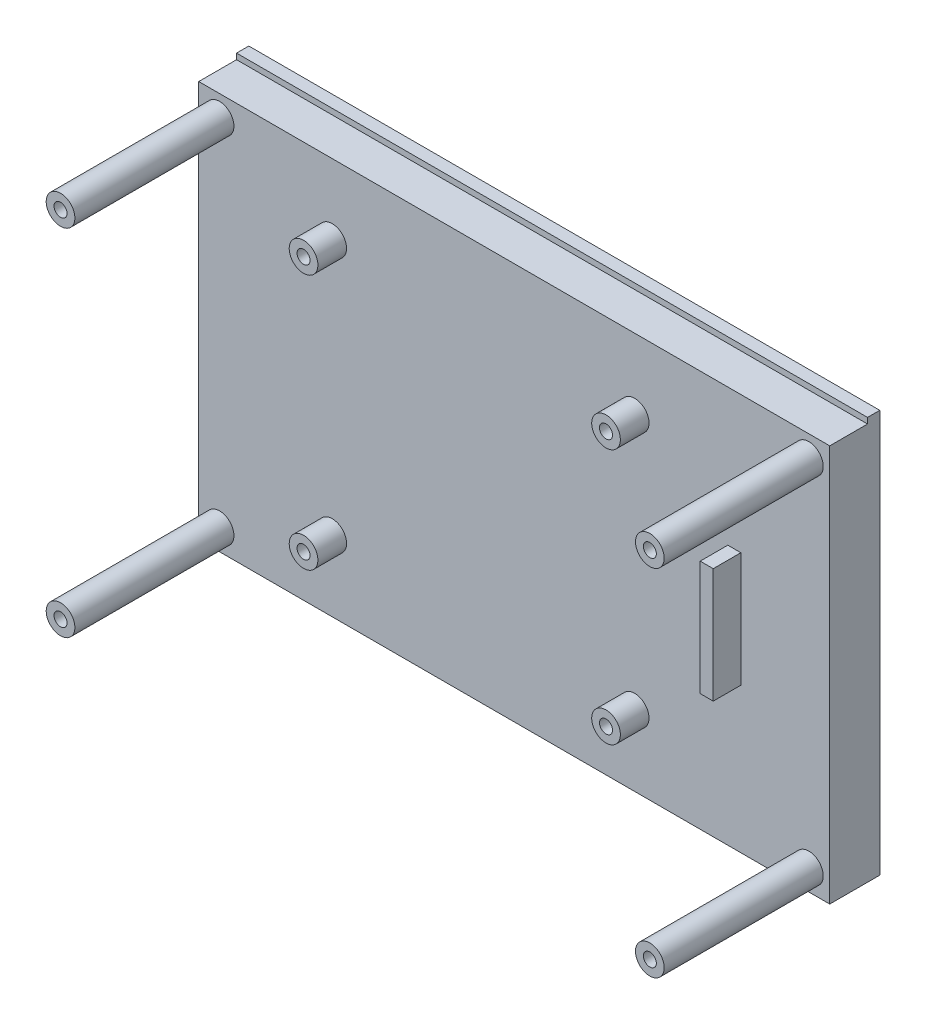
ISO-10303-21;
HEADER;
FILE_DESCRIPTION(('STEP AP214'),'2;1');
FILE_NAME('part.step','',(''),(''),'','','');
FILE_SCHEMA(('AUTOMOTIVE_DESIGN { 1 0 10303 214 1 1 1 1 }'));
ENDSEC;
DATA;
#1=APPLICATION_CONTEXT('core data for automotive mechanical design processes');
#2=APPLICATION_PROTOCOL_DEFINITION('international standard','automotive_design',2000,#1);
#3=PRODUCT_CONTEXT('',#1,'mechanical');
#4=PRODUCT('Part','Part','',(#3));
#5=PRODUCT_RELATED_PRODUCT_CATEGORY('part','',(#4));
#6=PRODUCT_DEFINITION_FORMATION('','',#4);
#7=PRODUCT_DEFINITION_CONTEXT('part definition',#1,'design');
#8=PRODUCT_DEFINITION('design','',#6,#7);
#9=PRODUCT_DEFINITION_SHAPE('','',#8);
#10=(LENGTH_UNIT() NAMED_UNIT(*) SI_UNIT(.MILLI.,.METRE.));
#11=(NAMED_UNIT(*) PLANE_ANGLE_UNIT() SI_UNIT($,.RADIAN.));
#12=(NAMED_UNIT(*) SI_UNIT($,.STERADIAN.) SOLID_ANGLE_UNIT());
#13=UNCERTAINTY_MEASURE_WITH_UNIT(LENGTH_MEASURE(1.E-05),#10,'distance_accuracy_value','');
#14=(GEOMETRIC_REPRESENTATION_CONTEXT(3) GLOBAL_UNCERTAINTY_ASSIGNED_CONTEXT((#13)) GLOBAL_UNIT_ASSIGNED_CONTEXT((#10,
#11,#12)) REPRESENTATION_CONTEXT('',''));
#15=CARTESIAN_POINT('',(0.,0.,0.));
#16=DIRECTION('',(0.,0.,1.));
#17=DIRECTION('',(1.,0.,0.));
#18=AXIS2_PLACEMENT_3D('',#15,#16,#17);
#19=CARTESIAN_POINT('',(0.,0.,7.25));
#20=DIRECTION('',(0.,0.,1.));
#21=DIRECTION('',(1.,0.,0.));
#22=AXIS2_PLACEMENT_3D('',#19,#20,#21);
#23=PLANE('',#22);
#24=CARTESIAN_POINT('',(-56.5,-34.,7.25));
#25=DIRECTION('',(0.,0.,1.));
#26=DIRECTION('',(-1.,0.,0.));
#27=AXIS2_PLACEMENT_3D('',#24,#25,#26);
#28=CIRCLE('',#27,2.75);
#29=CARTESIAN_POINT('',(-59.25,-34.,7.25));
#30=VERTEX_POINT('',#29);
#31=EDGE_CURVE('E188',#30,#30,#28,.T.);
#32=ORIENTED_EDGE('',*,*,#31,.F.);
#33=EDGE_LOOP('',(#32));
#34=FACE_BOUND('',#33,.T.);
#35=CARTESIAN_POINT('',(56.5,-34.,7.25));
#36=DIRECTION('',(0.,0.,1.));
#37=DIRECTION('',(1.,0.,0.));
#38=AXIS2_PLACEMENT_3D('',#35,#36,#37);
#39=CIRCLE('',#38,2.75);
#40=CARTESIAN_POINT('',(59.25,-34.,7.25));
#41=VERTEX_POINT('',#40);
#42=EDGE_CURVE('E196',#41,#41,#39,.T.);
#43=ORIENTED_EDGE('',*,*,#42,.F.);
#44=EDGE_LOOP('',(#43));
#45=FACE_BOUND('',#44,.T.);
#46=CARTESIAN_POINT('',(56.5,34.,7.25));
#47=DIRECTION('',(0.,0.,1.));
#48=DIRECTION('',(-1.,0.,0.));
#49=AXIS2_PLACEMENT_3D('',#46,#47,#48);
#50=CIRCLE('',#49,2.75);
#51=CARTESIAN_POINT('',(53.75,34.,7.25));
#52=VERTEX_POINT('',#51);
#53=EDGE_CURVE('E199',#52,#52,#50,.T.);
#54=ORIENTED_EDGE('',*,*,#53,.F.);
#55=EDGE_LOOP('',(#54));
#56=FACE_BOUND('',#55,.T.);
#57=CARTESIAN_POINT('',(-56.5,34.,7.25));
#58=DIRECTION('',(0.,0.,1.));
#59=DIRECTION('',(1.,0.,0.));
#60=AXIS2_PLACEMENT_3D('',#57,#58,#59);
#61=CIRCLE('',#60,2.75);
#62=CARTESIAN_POINT('',(-53.75,34.,7.25));
#63=VERTEX_POINT('',#62);
#64=EDGE_CURVE('E202',#63,#63,#61,.T.);
#65=ORIENTED_EDGE('',*,*,#64,.F.);
#66=EDGE_LOOP('',(#65));
#67=FACE_BOUND('',#66,.T.);
#68=CARTESIAN_POINT('',(-34.9,-24.5,7.25));
#69=DIRECTION('',(0.,0.,1.));
#70=DIRECTION('',(-1.,0.,0.));
#71=AXIS2_PLACEMENT_3D('',#68,#69,#70);
#72=CIRCLE('',#71,2.74999999999999);
#73=CARTESIAN_POINT('',(-37.65,-24.5,7.25));
#74=VERTEX_POINT('',#73);
#75=EDGE_CURVE('E208',#74,#74,#72,.T.);
#76=ORIENTED_EDGE('',*,*,#75,.F.);
#77=EDGE_LOOP('',(#76));
#78=FACE_BOUND('',#77,.T.);
#79=CARTESIAN_POINT('',(23.1,-24.5,7.25));
#80=DIRECTION('',(0.,0.,1.));
#81=DIRECTION('',(1.,0.,0.));
#82=AXIS2_PLACEMENT_3D('',#79,#80,#81);
#83=CIRCLE('',#82,2.75);
#84=CARTESIAN_POINT('',(25.85,-24.5,7.25));
#85=VERTEX_POINT('',#84);
#86=EDGE_CURVE('E217',#85,#85,#83,.T.);
#87=ORIENTED_EDGE('',*,*,#86,.F.);
#88=EDGE_LOOP('',(#87));
#89=FACE_BOUND('',#88,.T.);
#90=CARTESIAN_POINT('',(23.1,24.5,7.25));
#91=DIRECTION('',(0.,0.,1.));
#92=DIRECTION('',(-1.,0.,0.));
#93=AXIS2_PLACEMENT_3D('',#90,#91,#92);
#94=CIRCLE('',#93,2.75);
#95=CARTESIAN_POINT('',(20.35,24.5,7.25));
#96=VERTEX_POINT('',#95);
#97=EDGE_CURVE('E226',#96,#96,#94,.T.);
#98=ORIENTED_EDGE('',*,*,#97,.F.);
#99=EDGE_LOOP('',(#98));
#100=FACE_BOUND('',#99,.T.);
#101=CARTESIAN_POINT('',(-34.9,24.5,7.25));
#102=DIRECTION('',(0.,0.,1.));
#103=DIRECTION('',(1.,0.,0.));
#104=AXIS2_PLACEMENT_3D('',#101,#102,#103);
#105=CIRCLE('',#104,2.74999999999999);
#106=CARTESIAN_POINT('',(-32.15,24.5,7.25));
#107=VERTEX_POINT('',#106);
#108=EDGE_CURVE('E235',#107,#107,#105,.T.);
#109=ORIENTED_EDGE('',*,*,#108,.F.);
#110=EDGE_LOOP('',(#109));
#111=FACE_BOUND('',#110,.T.);
#112=DIRECTION('',(0.,-1.,0.));
#113=VECTOR('',#112,1.);
#114=CARTESIAN_POINT('',(-60.5,38.05,7.25));
#115=LINE('',#114,#113);
#116=CARTESIAN_POINT('',(-60.5,38.05,7.25));
#117=VERTEX_POINT('',#116);
#118=CARTESIAN_POINT('',(-60.5,-38.05,7.25));
#119=VERTEX_POINT('',#118);
#120=EDGE_CURVE('E265',#117,#119,#115,.T.);
#121=ORIENTED_EDGE('',*,*,#120,.T.);
#122=DIRECTION('',(1.,0.,0.));
#123=VECTOR('',#122,1.);
#124=CARTESIAN_POINT('',(-60.5,-38.05,7.25));
#125=LINE('',#124,#123);
#126=CARTESIAN_POINT('',(60.5,-38.05,7.25));
#127=VERTEX_POINT('',#126);
#128=EDGE_CURVE('E268',#119,#127,#125,.T.);
#129=ORIENTED_EDGE('',*,*,#128,.T.);
#130=DIRECTION('',(0.,1.,0.));
#131=VECTOR('',#130,1.);
#132=CARTESIAN_POINT('',(60.5,38.05,7.25));
#133=LINE('',#132,#131);
#134=CARTESIAN_POINT('',(60.5,38.05,7.25));
#135=VERTEX_POINT('',#134);
#136=EDGE_CURVE('E270',#127,#135,#133,.T.);
#137=ORIENTED_EDGE('',*,*,#136,.T.);
#138=DIRECTION('',(-1.,0.,0.));
#139=VECTOR('',#138,1.);
#140=CARTESIAN_POINT('',(-60.5,38.05,7.25));
#141=LINE('',#140,#139);
#142=EDGE_CURVE('E272',#135,#117,#141,.T.);
#143=ORIENTED_EDGE('',*,*,#142,.T.);
#144=EDGE_LOOP('',(#121,#129,#137,#143));
#145=FACE_BOUND('',#144,.T.);
#146=DIRECTION('',(1.,0.,0.));
#147=VECTOR('',#146,1.);
#148=CARTESIAN_POINT('',(40.9579688697133,-10.2184813117999,7.25));
#149=LINE('',#148,#147);
#150=CARTESIAN_POINT('',(40.9579688697133,-10.2184813117999,7.25));
#151=VERTEX_POINT('',#150);
#152=CARTESIAN_POINT('',(43.4579688697133,-10.2184813117999,7.25));
#153=VERTEX_POINT('',#152);
#154=EDGE_CURVE('E441',#151,#153,#149,.T.);
#155=ORIENTED_EDGE('',*,*,#154,.F.);
#156=DIRECTION('',(0.,-1.,0.));
#157=VECTOR('',#156,1.);
#158=CARTESIAN_POINT('',(40.9579688697133,11.7815186882001,7.25));
#159=LINE('',#158,#157);
#160=CARTESIAN_POINT('',(40.9579688697133,11.7815186882001,7.25));
#161=VERTEX_POINT('',#160);
#162=EDGE_CURVE('E157',#161,#151,#159,.T.);
#163=ORIENTED_EDGE('',*,*,#162,.F.);
#164=DIRECTION('',(-1.,0.,0.));
#165=VECTOR('',#164,1.);
#166=CARTESIAN_POINT('',(40.9579688697133,11.7815186882001,7.25));
#167=LINE('',#166,#165);
#168=CARTESIAN_POINT('',(43.4579688697133,11.7815186882001,7.25));
#169=VERTEX_POINT('',#168);
#170=EDGE_CURVE('E153',#169,#161,#167,.T.);
#171=ORIENTED_EDGE('',*,*,#170,.F.);
#172=DIRECTION('',(0.,1.,0.));
#173=VECTOR('',#172,1.);
#174=CARTESIAN_POINT('',(43.4579688697133,11.7815186882001,7.25));
#175=LINE('',#174,#173);
#176=EDGE_CURVE('E443',#153,#169,#175,.T.);
#177=ORIENTED_EDGE('',*,*,#176,.F.);
#178=EDGE_LOOP('',(#155,#163,#171,#177));
#179=FACE_BOUND('',#178,.T.);
#180=ADVANCED_FACE('F33',(#34,#45,#56,#67,#78,#89,#100,#111,#145,#179),#23,.T.);
#181=CARTESIAN_POINT('',(-60.5,38.05,7.25));
#182=DIRECTION('',(1.,0.,0.));
#183=DIRECTION('',(0.,1.,0.));
#184=AXIS2_PLACEMENT_3D('',#181,#182,#183);
#185=PLANE('',#184);
#186=DIRECTION('',(0.,0.,-1.));
#187=VECTOR('',#186,1.);
#188=CARTESIAN_POINT('',(-60.5,38.05,7.25));
#189=LINE('',#188,#187);
#190=CARTESIAN_POINT('',(-60.5,38.05,0.));
#191=VERTEX_POINT('',#190);
#192=EDGE_CURVE('E274',#117,#191,#189,.T.);
#193=ORIENTED_EDGE('',*,*,#192,.T.);
#194=DIRECTION('',(0.,1.,0.));
#195=VECTOR('',#194,1.);
#196=CARTESIAN_POINT('',(-60.5,-38.05,0.));
#197=LINE('',#196,#195);
#198=CARTESIAN_POINT('',(-60.5,39.15,0.));
#199=VERTEX_POINT('',#198);
#200=EDGE_CURVE('E256',#191,#199,#197,.T.);
#201=ORIENTED_EDGE('',*,*,#200,.T.);
#202=DIRECTION('',(0.,0.,1.));
#203=VECTOR('',#202,1.);
#204=CARTESIAN_POINT('',(-60.5,39.15,-2.35));
#205=LINE('',#204,#203);
#206=CARTESIAN_POINT('',(-60.5,39.15,-2.35));
#207=VERTEX_POINT('',#206);
#208=EDGE_CURVE('E261',#207,#199,#205,.T.);
#209=ORIENTED_EDGE('',*,*,#208,.F.);
#210=DIRECTION('',(0.,1.,0.));
#211=VECTOR('',#210,1.);
#212=CARTESIAN_POINT('',(-60.5,-38.05,-2.35));
#213=LINE('',#212,#211);
#214=CARTESIAN_POINT('',(-60.5,-38.05,-2.35));
#215=VERTEX_POINT('',#214);
#216=EDGE_CURVE('E249',#215,#207,#213,.T.);
#217=ORIENTED_EDGE('',*,*,#216,.F.);
#218=DIRECTION('',(0.,0.,-1.));
#219=VECTOR('',#218,1.);
#220=CARTESIAN_POINT('',(-60.5,-38.05,7.25));
#221=LINE('',#220,#219);
#222=EDGE_CURVE('E284',#119,#215,#221,.T.);
#223=ORIENTED_EDGE('',*,*,#222,.F.);
#224=ORIENTED_EDGE('',*,*,#120,.F.);
#225=EDGE_LOOP('',(#193,#201,#209,#217,#223,#224));
#226=FACE_BOUND('',#225,.T.);
#227=ADVANCED_FACE('F35',(#226),#185,.F.);
#228=CARTESIAN_POINT('',(-60.5,-38.05,7.25));
#229=DIRECTION('',(0.,1.,0.));
#230=DIRECTION('',(-1.,0.,0.));
#231=AXIS2_PLACEMENT_3D('',#228,#229,#230);
#232=PLANE('',#231);
#233=ORIENTED_EDGE('',*,*,#222,.T.);
#234=DIRECTION('',(-1.,0.,0.));
#235=VECTOR('',#234,1.);
#236=CARTESIAN_POINT('',(60.5,-38.05,-2.35));
#237=LINE('',#236,#235);
#238=CARTESIAN_POINT('',(60.5,-38.05,-2.35));
#239=VERTEX_POINT('',#238);
#240=EDGE_CURVE('E245',#239,#215,#237,.T.);
#241=ORIENTED_EDGE('',*,*,#240,.F.);
#242=DIRECTION('',(0.,0.,-1.));
#243=VECTOR('',#242,1.);
#244=CARTESIAN_POINT('',(60.5,-38.05,7.25));
#245=LINE('',#244,#243);
#246=EDGE_CURVE('E282',#127,#239,#245,.T.);
#247=ORIENTED_EDGE('',*,*,#246,.F.);
#248=ORIENTED_EDGE('',*,*,#128,.F.);
#249=EDGE_LOOP('',(#233,#241,#247,#248));
#250=FACE_BOUND('',#249,.T.);
#251=ADVANCED_FACE('F339',(#250),#232,.F.);
#252=CARTESIAN_POINT('',(60.5,38.05,7.25));
#253=DIRECTION('',(-1.,0.,0.));
#254=DIRECTION('',(0.,0.,1.));
#255=AXIS2_PLACEMENT_3D('',#252,#253,#254);
#256=PLANE('',#255);
#257=ORIENTED_EDGE('',*,*,#246,.T.);
#258=DIRECTION('',(0.,-1.,0.));
#259=VECTOR('',#258,1.);
#260=CARTESIAN_POINT('',(60.5,-38.05,-2.35));
#261=LINE('',#260,#259);
#262=CARTESIAN_POINT('',(60.5,39.15,-2.35));
#263=VERTEX_POINT('',#262);
#264=EDGE_CURVE('E242',#263,#239,#261,.T.);
#265=ORIENTED_EDGE('',*,*,#264,.F.);
#266=DIRECTION('',(0.,0.,1.));
#267=VECTOR('',#266,1.);
#268=CARTESIAN_POINT('',(60.5,39.15,-2.35));
#269=LINE('',#268,#267);
#270=CARTESIAN_POINT('',(60.5,39.15,0.));
#271=VERTEX_POINT('',#270);
#272=EDGE_CURVE('E253',#263,#271,#269,.T.);
#273=ORIENTED_EDGE('',*,*,#272,.T.);
#274=DIRECTION('',(0.,-1.,0.));
#275=VECTOR('',#274,1.);
#276=CARTESIAN_POINT('',(60.5,-38.05,0.));
#277=LINE('',#276,#275);
#278=CARTESIAN_POINT('',(60.5,38.05,0.));
#279=VERTEX_POINT('',#278);
#280=EDGE_CURVE('E239',#271,#279,#277,.T.);
#281=ORIENTED_EDGE('',*,*,#280,.T.);
#282=DIRECTION('',(0.,0.,-1.));
#283=VECTOR('',#282,1.);
#284=CARTESIAN_POINT('',(60.5,38.05,7.25));
#285=LINE('',#284,#283);
#286=EDGE_CURVE('E279',#135,#279,#285,.T.);
#287=ORIENTED_EDGE('',*,*,#286,.F.);
#288=ORIENTED_EDGE('',*,*,#136,.F.);
#289=EDGE_LOOP('',(#257,#265,#273,#281,#287,#288));
#290=FACE_BOUND('',#289,.T.);
#291=ADVANCED_FACE('F538',(#290),#256,.F.);
#292=CARTESIAN_POINT('',(-60.5,38.05,7.25));
#293=DIRECTION('',(0.,-1.,0.));
#294=DIRECTION('',(0.,0.,-1.));
#295=AXIS2_PLACEMENT_3D('',#292,#293,#294);
#296=PLANE('',#295);
#297=DIRECTION('',(-1.,0.,0.));
#298=VECTOR('',#297,1.);
#299=CARTESIAN_POINT('',(-60.5,38.05,0.));
#300=LINE('',#299,#298);
#301=EDGE_CURVE('E264',#279,#191,#300,.T.);
#302=ORIENTED_EDGE('',*,*,#301,.T.);
#303=ORIENTED_EDGE('',*,*,#192,.F.);
#304=ORIENTED_EDGE('',*,*,#142,.F.);
#305=ORIENTED_EDGE('',*,*,#286,.T.);
#306=EDGE_LOOP('',(#302,#303,#304,#305));
#307=FACE_BOUND('',#306,.T.);
#308=ADVANCED_FACE('F525',(#307),#296,.F.);
#309=CARTESIAN_POINT('',(0.,0.,0.));
#310=DIRECTION('',(0.,0.,1.));
#311=DIRECTION('',(1.,0.,0.));
#312=AXIS2_PLACEMENT_3D('',#309,#310,#311);
#313=PLANE('',#312);
#314=ORIENTED_EDGE('',*,*,#301,.F.);
#315=ORIENTED_EDGE('',*,*,#280,.F.);
#316=DIRECTION('',(1.,0.,0.));
#317=VECTOR('',#316,1.);
#318=CARTESIAN_POINT('',(60.5,39.15,0.));
#319=LINE('',#318,#317);
#320=EDGE_CURVE('E246',#199,#271,#319,.T.);
#321=ORIENTED_EDGE('',*,*,#320,.F.);
#322=ORIENTED_EDGE('',*,*,#200,.F.);
#323=EDGE_LOOP('',(#314,#315,#321,#322));
#324=FACE_BOUND('',#323,.T.);
#325=ADVANCED_FACE('F523',(#324),#313,.T.);
#326=CARTESIAN_POINT('',(60.5,39.15,-2.35));
#327=DIRECTION('',(0.,-1.,0.));
#328=DIRECTION('',(0.,0.,-1.));
#329=AXIS2_PLACEMENT_3D('',#326,#327,#328);
#330=PLANE('',#329);
#331=ORIENTED_EDGE('',*,*,#320,.T.);
#332=ORIENTED_EDGE('',*,*,#272,.F.);
#333=DIRECTION('',(1.,0.,0.));
#334=VECTOR('',#333,1.);
#335=CARTESIAN_POINT('',(60.5,39.15,-2.35));
#336=LINE('',#335,#334);
#337=EDGE_CURVE('E251',#207,#263,#336,.T.);
#338=ORIENTED_EDGE('',*,*,#337,.F.);
#339=ORIENTED_EDGE('',*,*,#208,.T.);
#340=EDGE_LOOP('',(#331,#332,#338,#339));
#341=FACE_BOUND('',#340,.T.);
#342=ADVANCED_FACE('F521',(#341),#330,.F.);
#343=CARTESIAN_POINT('',(0.,0.,-2.35));
#344=DIRECTION('',(0.,0.,1.));
#345=DIRECTION('',(1.,0.,0.));
#346=AXIS2_PLACEMENT_3D('',#343,#344,#345);
#347=PLANE('',#346);
#348=DIRECTION('',(-1.,0.,0.));
#349=VECTOR('',#348,1.);
#350=CARTESIAN_POINT('',(54.2,-35.05,-2.35));
#351=LINE('',#350,#349);
#352=CARTESIAN_POINT('',(54.2,-35.05,-2.35));
#353=VERTEX_POINT('',#352);
#354=CARTESIAN_POINT('',(-54.2,-35.05,-2.35));
#355=VERTEX_POINT('',#354);
#356=EDGE_CURVE('E160',#353,#355,#351,.T.);
#357=ORIENTED_EDGE('',*,*,#356,.F.);
#358=DIRECTION('',(0.,-1.,0.));
#359=VECTOR('',#358,1.);
#360=CARTESIAN_POINT('',(54.2,30.65,-2.35));
#361=LINE('',#360,#359);
#362=CARTESIAN_POINT('',(54.2,30.65,-2.35));
#363=VERTEX_POINT('',#362);
#364=EDGE_CURVE('E56',#363,#353,#361,.T.);
#365=ORIENTED_EDGE('',*,*,#364,.F.);
#366=DIRECTION('',(1.,0.,0.));
#367=VECTOR('',#366,1.);
#368=CARTESIAN_POINT('',(54.2,30.65,-2.35));
#369=LINE('',#368,#367);
#370=CARTESIAN_POINT('',(-54.2,30.65,-2.35));
#371=VERTEX_POINT('',#370);
#372=EDGE_CURVE('E169',#371,#363,#369,.T.);
#373=ORIENTED_EDGE('',*,*,#372,.F.);
#374=DIRECTION('',(0.,1.,0.));
#375=VECTOR('',#374,1.);
#376=CARTESIAN_POINT('',(-54.2,30.65,-2.35));
#377=LINE('',#376,#375);
#378=EDGE_CURVE('E181',#355,#371,#377,.T.);
#379=ORIENTED_EDGE('',*,*,#378,.F.);
#380=EDGE_LOOP('',(#357,#365,#373,#379));
#381=FACE_BOUND('',#380,.T.);
#382=ORIENTED_EDGE('',*,*,#264,.T.);
#383=ORIENTED_EDGE('',*,*,#240,.T.);
#384=ORIENTED_EDGE('',*,*,#216,.T.);
#385=ORIENTED_EDGE('',*,*,#337,.T.);
#386=EDGE_LOOP('',(#382,#383,#384,#385));
#387=FACE_BOUND('',#386,.T.);
#388=ADVANCED_FACE('F514',(#381,#387),#347,.F.);
#389=CARTESIAN_POINT('',(-34.9,24.5,12.75));
#390=DIRECTION('',(0.,0.,1.));
#391=DIRECTION('',(1.,0.,0.));
#392=AXIS2_PLACEMENT_3D('',#389,#390,#391);
#393=PLANE('',#392);
#394=CARTESIAN_POINT('',(-34.9,24.5,12.75));
#395=DIRECTION('',(0.,0.,1.));
#396=DIRECTION('',(1.,0.,0.));
#397=AXIS2_PLACEMENT_3D('',#394,#395,#396);
#398=CIRCLE('',#397,2.74999999999999);
#399=CARTESIAN_POINT('',(-32.15,24.5,12.75));
#400=VERTEX_POINT('',#399);
#401=EDGE_CURVE('E236',#400,#400,#398,.T.);
#402=ORIENTED_EDGE('',*,*,#401,.T.);
#403=EDGE_LOOP('',(#402));
#404=FACE_BOUND('',#403,.T.);
#405=CARTESIAN_POINT('',(-34.9,24.5,12.75));
#406=DIRECTION('',(0.,0.,1.));
#407=DIRECTION('',(1.,0.,0.));
#408=AXIS2_PLACEMENT_3D('',#405,#406,#407);
#409=CIRCLE('',#408,1.25);
#410=CARTESIAN_POINT('',(-33.65,24.5,12.75));
#411=VERTEX_POINT('',#410);
#412=EDGE_CURVE('E230',#411,#411,#409,.T.);
#413=ORIENTED_EDGE('',*,*,#412,.F.);
#414=EDGE_LOOP('',(#413));
#415=FACE_BOUND('',#414,.T.);
#416=ADVANCED_FACE('F511',(#404,#415),#393,.T.);
#417=CARTESIAN_POINT('',(-34.9,24.5,12.75));
#418=DIRECTION('',(0.,0.,-1.));
#419=DIRECTION('',(-1.,0.,0.));
#420=AXIS2_PLACEMENT_3D('',#417,#418,#419);
#421=CYLINDRICAL_SURFACE('',#420,2.74999999999999);
#422=ORIENTED_EDGE('',*,*,#401,.F.);
#423=EDGE_LOOP('',(#422));
#424=FACE_BOUND('',#423,.T.);
#425=ORIENTED_EDGE('',*,*,#108,.T.);
#426=EDGE_LOOP('',(#425));
#427=FACE_BOUND('',#426,.T.);
#428=ADVANCED_FACE('F355',(#424,#427),#421,.T.);
#429=CARTESIAN_POINT('',(-34.9,24.5,12.75));
#430=DIRECTION('',(0.,0.,-1.));
#431=DIRECTION('',(-1.,0.,0.));
#432=AXIS2_PLACEMENT_3D('',#429,#430,#431);
#433=CYLINDRICAL_SURFACE('',#432,1.25);
#434=ORIENTED_EDGE('',*,*,#412,.T.);
#435=EDGE_LOOP('',(#434));
#436=FACE_BOUND('',#435,.T.);
#437=CARTESIAN_POINT('',(-34.9,24.5,7.25));
#438=DIRECTION('',(0.,0.,1.));
#439=DIRECTION('',(1.,0.,0.));
#440=AXIS2_PLACEMENT_3D('',#437,#438,#439);
#441=CIRCLE('',#440,1.25);
#442=CARTESIAN_POINT('',(-33.65,24.5,7.25));
#443=VERTEX_POINT('',#442);
#444=EDGE_CURVE('E286',#443,#443,#441,.F.);
#445=ORIENTED_EDGE('',*,*,#444,.T.);
#446=EDGE_LOOP('',(#445));
#447=FACE_BOUND('',#446,.T.);
#448=ADVANCED_FACE('F345',(#436,#447),#433,.F.);
#449=ORIENTED_EDGE('',*,*,#444,.F.);
#450=EDGE_LOOP('',(#449));
#451=FACE_BOUND('',#450,.T.);
#452=ADVANCED_FACE('F335',(#451),#23,.T.);
#453=CARTESIAN_POINT('',(23.1,24.5,12.75));
#454=DIRECTION('',(0.,0.,-1.));
#455=DIRECTION('',(-1.,0.,0.));
#456=AXIS2_PLACEMENT_3D('',#453,#454,#455);
#457=PLANE('',#456);
#458=CARTESIAN_POINT('',(23.1,24.5,12.75));
#459=DIRECTION('',(0.,0.,1.));
#460=DIRECTION('',(-1.,0.,0.));
#461=AXIS2_PLACEMENT_3D('',#458,#459,#460);
#462=CIRCLE('',#461,2.75);
#463=CARTESIAN_POINT('',(20.35,24.5,12.75));
#464=VERTEX_POINT('',#463);
#465=EDGE_CURVE('E227',#464,#464,#462,.T.);
#466=ORIENTED_EDGE('',*,*,#465,.T.);
#467=EDGE_LOOP('',(#466));
#468=FACE_BOUND('',#467,.T.);
#469=CARTESIAN_POINT('',(23.1,24.5,12.75));
#470=DIRECTION('',(0.,0.,1.));
#471=DIRECTION('',(-1.,0.,0.));
#472=AXIS2_PLACEMENT_3D('',#469,#470,#471);
#473=CIRCLE('',#472,1.25);
#474=CARTESIAN_POINT('',(21.85,24.5,12.75));
#475=VERTEX_POINT('',#474);
#476=EDGE_CURVE('E221',#475,#475,#473,.T.);
#477=ORIENTED_EDGE('',*,*,#476,.F.);
#478=EDGE_LOOP('',(#477));
#479=FACE_BOUND('',#478,.T.);
#480=ADVANCED_FACE('F344',(#468,#479),#457,.F.);
#481=CARTESIAN_POINT('',(23.1,24.5,12.75));
#482=DIRECTION('',(0.,0.,-1.));
#483=DIRECTION('',(-1.,0.,0.));
#484=AXIS2_PLACEMENT_3D('',#481,#482,#483);
#485=CYLINDRICAL_SURFACE('',#484,2.75);
#486=ORIENTED_EDGE('',*,*,#465,.F.);
#487=EDGE_LOOP('',(#486));
#488=FACE_BOUND('',#487,.T.);
#489=ORIENTED_EDGE('',*,*,#97,.T.);
#490=EDGE_LOOP('',(#489));
#491=FACE_BOUND('',#490,.T.);
#492=ADVANCED_FACE('F352',(#488,#491),#485,.T.);
#493=CARTESIAN_POINT('',(23.1,24.5,12.75));
#494=DIRECTION('',(0.,0.,-1.));
#495=DIRECTION('',(-1.,0.,0.));
#496=AXIS2_PLACEMENT_3D('',#493,#494,#495);
#497=CYLINDRICAL_SURFACE('',#496,1.25);
#498=ORIENTED_EDGE('',*,*,#476,.T.);
#499=EDGE_LOOP('',(#498));
#500=FACE_BOUND('',#499,.T.);
#501=CARTESIAN_POINT('',(23.1,24.5,7.25));
#502=DIRECTION('',(0.,0.,1.));
#503=DIRECTION('',(1.,0.,0.));
#504=AXIS2_PLACEMENT_3D('',#501,#502,#503);
#505=CIRCLE('',#504,1.25);
#506=CARTESIAN_POINT('',(24.35,24.5,7.25));
#507=VERTEX_POINT('',#506);
#508=EDGE_CURVE('E289',#507,#507,#505,.F.);
#509=ORIENTED_EDGE('',*,*,#508,.T.);
#510=EDGE_LOOP('',(#509));
#511=FACE_BOUND('',#510,.T.);
#512=ADVANCED_FACE('F361',(#500,#511),#497,.F.);
#513=ORIENTED_EDGE('',*,*,#508,.F.);
#514=EDGE_LOOP('',(#513));
#515=FACE_BOUND('',#514,.T.);
#516=ADVANCED_FACE('F347',(#515),#23,.T.);
#517=CARTESIAN_POINT('',(23.1,-24.5,12.75));
#518=DIRECTION('',(0.,0.,1.));
#519=DIRECTION('',(1.,0.,0.));
#520=AXIS2_PLACEMENT_3D('',#517,#518,#519);
#521=PLANE('',#520);
#522=CARTESIAN_POINT('',(23.1,-24.5,12.75));
#523=DIRECTION('',(0.,0.,1.));
#524=DIRECTION('',(1.,0.,0.));
#525=AXIS2_PLACEMENT_3D('',#522,#523,#524);
#526=CIRCLE('',#525,2.75);
#527=CARTESIAN_POINT('',(25.85,-24.5,12.75));
#528=VERTEX_POINT('',#527);
#529=EDGE_CURVE('E218',#528,#528,#526,.T.);
#530=ORIENTED_EDGE('',*,*,#529,.T.);
#531=EDGE_LOOP('',(#530));
#532=FACE_BOUND('',#531,.T.);
#533=CARTESIAN_POINT('',(23.1,-24.5,12.75));
#534=DIRECTION('',(0.,0.,1.));
#535=DIRECTION('',(1.,0.,0.));
#536=AXIS2_PLACEMENT_3D('',#533,#534,#535);
#537=CIRCLE('',#536,1.25);
#538=CARTESIAN_POINT('',(24.35,-24.5,12.75));
#539=VERTEX_POINT('',#538);
#540=EDGE_CURVE('E212',#539,#539,#537,.T.);
#541=ORIENTED_EDGE('',*,*,#540,.F.);
#542=EDGE_LOOP('',(#541));
#543=FACE_BOUND('',#542,.T.);
#544=ADVANCED_FACE('F360',(#532,#543),#521,.T.);
#545=CARTESIAN_POINT('',(23.1,-24.5,12.75));
#546=DIRECTION('',(0.,0.,-1.));
#547=DIRECTION('',(-1.,0.,0.));
#548=AXIS2_PLACEMENT_3D('',#545,#546,#547);
#549=CYLINDRICAL_SURFACE('',#548,2.75);
#550=ORIENTED_EDGE('',*,*,#529,.F.);
#551=EDGE_LOOP('',(#550));
#552=FACE_BOUND('',#551,.T.);
#553=ORIENTED_EDGE('',*,*,#86,.T.);
#554=EDGE_LOOP('',(#553));
#555=FACE_BOUND('',#554,.T.);
#556=ADVANCED_FACE('F368',(#552,#555),#549,.T.);
#557=CARTESIAN_POINT('',(23.1,-24.5,12.75));
#558=DIRECTION('',(0.,0.,-1.));
#559=DIRECTION('',(-1.,0.,0.));
#560=AXIS2_PLACEMENT_3D('',#557,#558,#559);
#561=CYLINDRICAL_SURFACE('',#560,1.25);
#562=ORIENTED_EDGE('',*,*,#540,.T.);
#563=EDGE_LOOP('',(#562));
#564=FACE_BOUND('',#563,.T.);
#565=CARTESIAN_POINT('',(23.1,-24.5,7.25));
#566=DIRECTION('',(0.,0.,1.));
#567=DIRECTION('',(1.,0.,0.));
#568=AXIS2_PLACEMENT_3D('',#565,#566,#567);
#569=CIRCLE('',#568,1.25);
#570=CARTESIAN_POINT('',(24.35,-24.5,7.25));
#571=VERTEX_POINT('',#570);
#572=EDGE_CURVE('E292',#571,#571,#569,.F.);
#573=ORIENTED_EDGE('',*,*,#572,.T.);
#574=EDGE_LOOP('',(#573));
#575=FACE_BOUND('',#574,.T.);
#576=ADVANCED_FACE('F376',(#564,#575),#561,.F.);
#577=ORIENTED_EDGE('',*,*,#572,.F.);
#578=EDGE_LOOP('',(#577));
#579=FACE_BOUND('',#578,.T.);
#580=ADVANCED_FACE('F363',(#579),#23,.T.);
#581=CARTESIAN_POINT('',(-34.9,-24.5,12.75));
#582=DIRECTION('',(0.,0.,-1.));
#583=DIRECTION('',(-1.,0.,0.));
#584=AXIS2_PLACEMENT_3D('',#581,#582,#583);
#585=PLANE('',#584);
#586=CARTESIAN_POINT('',(-34.9,-24.5,12.75));
#587=DIRECTION('',(0.,0.,1.));
#588=DIRECTION('',(-1.,0.,0.));
#589=AXIS2_PLACEMENT_3D('',#586,#587,#588);
#590=CIRCLE('',#589,2.74999999999999);
#591=CARTESIAN_POINT('',(-37.65,-24.5,12.75));
#592=VERTEX_POINT('',#591);
#593=EDGE_CURVE('E209',#592,#592,#590,.T.);
#594=ORIENTED_EDGE('',*,*,#593,.T.);
#595=EDGE_LOOP('',(#594));
#596=FACE_BOUND('',#595,.T.);
#597=CARTESIAN_POINT('',(-34.9,-24.5,12.75));
#598=DIRECTION('',(0.,0.,1.));
#599=DIRECTION('',(-1.,0.,0.));
#600=AXIS2_PLACEMENT_3D('',#597,#598,#599);
#601=CIRCLE('',#600,1.25);
#602=CARTESIAN_POINT('',(-36.15,-24.5,12.75));
#603=VERTEX_POINT('',#602);
#604=EDGE_CURVE('E205',#603,#603,#601,.T.);
#605=ORIENTED_EDGE('',*,*,#604,.F.);
#606=EDGE_LOOP('',(#605));
#607=FACE_BOUND('',#606,.T.);
#608=ADVANCED_FACE('F375',(#596,#607),#585,.F.);
#609=CARTESIAN_POINT('',(-34.9,-24.5,12.75));
#610=DIRECTION('',(0.,0.,-1.));
#611=DIRECTION('',(-1.,0.,0.));
#612=AXIS2_PLACEMENT_3D('',#609,#610,#611);
#613=CYLINDRICAL_SURFACE('',#612,2.74999999999999);
#614=ORIENTED_EDGE('',*,*,#593,.F.);
#615=EDGE_LOOP('',(#614));
#616=FACE_BOUND('',#615,.T.);
#617=ORIENTED_EDGE('',*,*,#75,.T.);
#618=EDGE_LOOP('',(#617));
#619=FACE_BOUND('',#618,.T.);
#620=ADVANCED_FACE('F383',(#616,#619),#613,.T.);
#621=CARTESIAN_POINT('',(-34.9,-24.5,12.75));
#622=DIRECTION('',(0.,0.,-1.));
#623=DIRECTION('',(-1.,0.,0.));
#624=AXIS2_PLACEMENT_3D('',#621,#622,#623);
#625=CYLINDRICAL_SURFACE('',#624,1.25);
#626=ORIENTED_EDGE('',*,*,#604,.T.);
#627=EDGE_LOOP('',(#626));
#628=FACE_BOUND('',#627,.T.);
#629=CARTESIAN_POINT('',(-34.9,-24.5,7.25));
#630=DIRECTION('',(0.,0.,1.));
#631=DIRECTION('',(1.,0.,0.));
#632=AXIS2_PLACEMENT_3D('',#629,#630,#631);
#633=CIRCLE('',#632,1.25);
#634=CARTESIAN_POINT('',(-33.65,-24.5,7.25));
#635=VERTEX_POINT('',#634);
#636=EDGE_CURVE('E295',#635,#635,#633,.F.);
#637=ORIENTED_EDGE('',*,*,#636,.T.);
#638=EDGE_LOOP('',(#637));
#639=FACE_BOUND('',#638,.T.);
#640=ADVANCED_FACE('F391',(#628,#639),#625,.F.);
#641=ORIENTED_EDGE('',*,*,#636,.F.);
#642=EDGE_LOOP('',(#641));
#643=FACE_BOUND('',#642,.T.);
#644=ADVANCED_FACE('F378',(#643),#23,.T.);
#645=CARTESIAN_POINT('',(-56.5,34.,12.75));
#646=DIRECTION('',(0.,0.,-1.));
#647=DIRECTION('',(-1.,0.,0.));
#648=AXIS2_PLACEMENT_3D('',#645,#646,#647);
#649=CYLINDRICAL_SURFACE('',#648,2.75);
#650=ORIENTED_EDGE('',*,*,#64,.T.);
#651=EDGE_LOOP('',(#650));
#652=FACE_BOUND('',#651,.T.);
#653=CARTESIAN_POINT('',(-56.5,34.,37.75));
#654=DIRECTION('',(0.,0.,1.));
#655=DIRECTION('',(1.,0.,0.));
#656=AXIS2_PLACEMENT_3D('',#653,#654,#655);
#657=CIRCLE('',#656,2.75);
#658=CARTESIAN_POINT('',(-53.75,34.,37.75));
#659=VERTEX_POINT('',#658);
#660=EDGE_CURVE('E421',#659,#659,#657,.T.);
#661=ORIENTED_EDGE('',*,*,#660,.F.);
#662=EDGE_LOOP('',(#661));
#663=FACE_BOUND('',#662,.T.);
#664=ADVANCED_FACE('F390',(#652,#663),#649,.T.);
#665=CARTESIAN_POINT('',(56.5,34.,12.75));
#666=DIRECTION('',(0.,0.,-1.));
#667=DIRECTION('',(-1.,0.,0.));
#668=AXIS2_PLACEMENT_3D('',#665,#666,#667);
#669=CYLINDRICAL_SURFACE('',#668,2.75);
#670=ORIENTED_EDGE('',*,*,#53,.T.);
#671=EDGE_LOOP('',(#670));
#672=FACE_BOUND('',#671,.T.);
#673=CARTESIAN_POINT('',(56.5,34.,37.75));
#674=DIRECTION('',(0.,0.,1.));
#675=DIRECTION('',(1.,0.,0.));
#676=AXIS2_PLACEMENT_3D('',#673,#674,#675);
#677=CIRCLE('',#676,2.75);
#678=CARTESIAN_POINT('',(59.25,34.,37.75));
#679=VERTEX_POINT('',#678);
#680=EDGE_CURVE('E422',#679,#679,#677,.T.);
#681=ORIENTED_EDGE('',*,*,#680,.F.);
#682=EDGE_LOOP('',(#681));
#683=FACE_BOUND('',#682,.T.);
#684=ADVANCED_FACE('F397',(#672,#683),#669,.T.);
#685=CARTESIAN_POINT('',(56.5,-34.,12.75));
#686=DIRECTION('',(0.,0.,-1.));
#687=DIRECTION('',(-1.,0.,0.));
#688=AXIS2_PLACEMENT_3D('',#685,#686,#687);
#689=CYLINDRICAL_SURFACE('',#688,2.75);
#690=ORIENTED_EDGE('',*,*,#42,.T.);
#691=EDGE_LOOP('',(#690));
#692=FACE_BOUND('',#691,.T.);
#693=CARTESIAN_POINT('',(56.5,-34.,37.75));
#694=DIRECTION('',(0.,0.,1.));
#695=DIRECTION('',(1.,0.,0.));
#696=AXIS2_PLACEMENT_3D('',#693,#694,#695);
#697=CIRCLE('',#696,2.75);
#698=CARTESIAN_POINT('',(59.25,-34.,37.75));
#699=VERTEX_POINT('',#698);
#700=EDGE_CURVE('E857',#699,#699,#697,.T.);
#701=ORIENTED_EDGE('',*,*,#700,.F.);
#702=EDGE_LOOP('',(#701));
#703=FACE_BOUND('',#702,.T.);
#704=ADVANCED_FACE('F490',(#692,#703),#689,.T.);
#705=CARTESIAN_POINT('',(-56.5,-34.,12.75));
#706=DIRECTION('',(0.,0.,-1.));
#707=DIRECTION('',(-1.,0.,0.));
#708=AXIS2_PLACEMENT_3D('',#705,#706,#707);
#709=CYLINDRICAL_SURFACE('',#708,2.75);
#710=ORIENTED_EDGE('',*,*,#31,.T.);
#711=EDGE_LOOP('',(#710));
#712=FACE_BOUND('',#711,.T.);
#713=CARTESIAN_POINT('',(-56.5,-34.,37.75));
#714=DIRECTION('',(0.,0.,1.));
#715=DIRECTION('',(1.,0.,0.));
#716=AXIS2_PLACEMENT_3D('',#713,#714,#715);
#717=CIRCLE('',#716,2.75);
#718=CARTESIAN_POINT('',(-53.75,-34.,37.75));
#719=VERTEX_POINT('',#718);
#720=EDGE_CURVE('E434',#719,#719,#717,.T.);
#721=ORIENTED_EDGE('',*,*,#720,.F.);
#722=EDGE_LOOP('',(#721));
#723=FACE_BOUND('',#722,.T.);
#724=ADVANCED_FACE('F485',(#712,#723),#709,.T.);
#725=CARTESIAN_POINT('',(54.2,30.65,-1.35));
#726=DIRECTION('',(1.,0.,0.));
#727=DIRECTION('',(0.,1.,0.));
#728=AXIS2_PLACEMENT_3D('',#725,#726,#727);
#729=PLANE('',#728);
#730=ORIENTED_EDGE('',*,*,#364,.T.);
#731=DIRECTION('',(0.,0.,-1.));
#732=VECTOR('',#731,1.);
#733=CARTESIAN_POINT('',(54.2,-35.05,-1.35));
#734=LINE('',#733,#732);
#735=CARTESIAN_POINT('',(54.2,-35.05,-1.35));
#736=VERTEX_POINT('',#735);
#737=EDGE_CURVE('E177',#736,#353,#734,.T.);
#738=ORIENTED_EDGE('',*,*,#737,.F.);
#739=DIRECTION('',(0.,-1.,0.));
#740=VECTOR('',#739,1.);
#741=CARTESIAN_POINT('',(54.2,30.65,-1.35));
#742=LINE('',#741,#740);
#743=CARTESIAN_POINT('',(54.2,30.65,-1.35));
#744=VERTEX_POINT('',#743);
#745=EDGE_CURVE('E165',#744,#736,#742,.T.);
#746=ORIENTED_EDGE('',*,*,#745,.F.);
#747=DIRECTION('',(0.,0.,-1.));
#748=VECTOR('',#747,1.);
#749=CARTESIAN_POINT('',(54.2,30.65,-1.35));
#750=LINE('',#749,#748);
#751=EDGE_CURVE('E186',#744,#363,#750,.T.);
#752=ORIENTED_EDGE('',*,*,#751,.T.);
#753=EDGE_LOOP('',(#730,#738,#746,#752));
#754=FACE_BOUND('',#753,.T.);
#755=ADVANCED_FACE('F475',(#754),#729,.F.);
#756=CARTESIAN_POINT('',(54.2,30.65,-1.35));
#757=DIRECTION('',(0.,1.,0.));
#758=DIRECTION('',(0.,0.,1.));
#759=AXIS2_PLACEMENT_3D('',#756,#757,#758);
#760=PLANE('',#759);
#761=ORIENTED_EDGE('',*,*,#372,.T.);
#762=ORIENTED_EDGE('',*,*,#751,.F.);
#763=DIRECTION('',(1.,0.,0.));
#764=VECTOR('',#763,1.);
#765=CARTESIAN_POINT('',(54.2,30.65,-1.35));
#766=LINE('',#765,#764);
#767=CARTESIAN_POINT('',(-54.2,30.65,-1.35));
#768=VERTEX_POINT('',#767);
#769=EDGE_CURVE('E175',#768,#744,#766,.T.);
#770=ORIENTED_EDGE('',*,*,#769,.F.);
#771=DIRECTION('',(0.,0.,-1.));
#772=VECTOR('',#771,1.);
#773=CARTESIAN_POINT('',(-54.2,30.65,-1.35));
#774=LINE('',#773,#772);
#775=EDGE_CURVE('E189',#768,#371,#774,.T.);
#776=ORIENTED_EDGE('',*,*,#775,.T.);
#777=EDGE_LOOP('',(#761,#762,#770,#776));
#778=FACE_BOUND('',#777,.T.);
#779=ADVANCED_FACE('F471',(#778),#760,.F.);
#780=CARTESIAN_POINT('',(-54.2,30.65,-1.35));
#781=DIRECTION('',(-1.,0.,0.));
#782=DIRECTION('',(0.,-1.,0.));
#783=AXIS2_PLACEMENT_3D('',#780,#781,#782);
#784=PLANE('',#783);
#785=ORIENTED_EDGE('',*,*,#378,.T.);
#786=ORIENTED_EDGE('',*,*,#775,.F.);
#787=DIRECTION('',(0.,1.,0.));
#788=VECTOR('',#787,1.);
#789=CARTESIAN_POINT('',(-54.2,30.65,-1.35));
#790=LINE('',#789,#788);
#791=CARTESIAN_POINT('',(-54.2,-35.05,-1.35));
#792=VERTEX_POINT('',#791);
#793=EDGE_CURVE('E172',#792,#768,#790,.T.);
#794=ORIENTED_EDGE('',*,*,#793,.F.);
#795=DIRECTION('',(0.,0.,-1.));
#796=VECTOR('',#795,1.);
#797=CARTESIAN_POINT('',(-54.2,-35.05,-1.35));
#798=LINE('',#797,#796);
#799=EDGE_CURVE('E191',#792,#355,#798,.T.);
#800=ORIENTED_EDGE('',*,*,#799,.T.);
#801=EDGE_LOOP('',(#785,#786,#794,#800));
#802=FACE_BOUND('',#801,.T.);
#803=ADVANCED_FACE('F474',(#802),#784,.F.);
#804=CARTESIAN_POINT('',(54.2,-35.05,-1.35));
#805=DIRECTION('',(0.,-1.,0.));
#806=DIRECTION('',(0.,0.,-1.));
#807=AXIS2_PLACEMENT_3D('',#804,#805,#806);
#808=PLANE('',#807);
#809=ORIENTED_EDGE('',*,*,#356,.T.);
#810=ORIENTED_EDGE('',*,*,#799,.F.);
#811=DIRECTION('',(-1.,0.,0.));
#812=VECTOR('',#811,1.);
#813=CARTESIAN_POINT('',(54.2,-35.05,-1.35));
#814=LINE('',#813,#812);
#815=EDGE_CURVE('E168',#736,#792,#814,.T.);
#816=ORIENTED_EDGE('',*,*,#815,.F.);
#817=ORIENTED_EDGE('',*,*,#737,.T.);
#818=EDGE_LOOP('',(#809,#810,#816,#817));
#819=FACE_BOUND('',#818,.T.);
#820=ADVANCED_FACE('F469',(#819),#808,.F.);
#821=CARTESIAN_POINT('',(0.,0.,-1.35));
#822=DIRECTION('',(0.,0.,-1.));
#823=DIRECTION('',(-1.,0.,0.));
#824=AXIS2_PLACEMENT_3D('',#821,#822,#823);
#825=PLANE('',#824);
#826=ORIENTED_EDGE('',*,*,#745,.T.);
#827=ORIENTED_EDGE('',*,*,#815,.T.);
#828=ORIENTED_EDGE('',*,*,#793,.T.);
#829=ORIENTED_EDGE('',*,*,#769,.T.);
#830=EDGE_LOOP('',(#826,#827,#828,#829));
#831=FACE_BOUND('',#830,.T.);
#832=ADVANCED_FACE('F466',(#831),#825,.T.);
#833=CARTESIAN_POINT('',(40.9579688697133,11.7815186882001,12.55));
#834=DIRECTION('',(1.,0.,0.));
#835=DIRECTION('',(0.,0.,-1.));
#836=AXIS2_PLACEMENT_3D('',#833,#834,#835);
#837=PLANE('',#836);
#838=ORIENTED_EDGE('',*,*,#162,.T.);
#839=DIRECTION('',(0.,0.,-1.));
#840=VECTOR('',#839,1.);
#841=CARTESIAN_POINT('',(40.9579688697133,-10.2184813117999,12.55));
#842=LINE('',#841,#840);
#843=CARTESIAN_POINT('',(40.9579688697133,-10.2184813117999,12.55));
#844=VERTEX_POINT('',#843);
#845=EDGE_CURVE('E138',#844,#151,#842,.T.);
#846=ORIENTED_EDGE('',*,*,#845,.F.);
#847=DIRECTION('',(0.,-1.,0.));
#848=VECTOR('',#847,1.);
#849=CARTESIAN_POINT('',(40.9579688697133,11.7815186882001,12.55));
#850=LINE('',#849,#848);
#851=CARTESIAN_POINT('',(40.9579688697133,11.7815186882001,12.55));
#852=VERTEX_POINT('',#851);
#853=EDGE_CURVE('E145',#852,#844,#850,.T.);
#854=ORIENTED_EDGE('',*,*,#853,.F.);
#855=DIRECTION('',(0.,0.,-1.));
#856=VECTOR('',#855,1.);
#857=CARTESIAN_POINT('',(40.9579688697133,11.7815186882001,12.55));
#858=LINE('',#857,#856);
#859=EDGE_CURVE('E439',#852,#161,#858,.T.);
#860=ORIENTED_EDGE('',*,*,#859,.T.);
#861=EDGE_LOOP('',(#838,#846,#854,#860));
#862=FACE_BOUND('',#861,.T.);
#863=ADVANCED_FACE('F155',(#862),#837,.F.);
#864=CARTESIAN_POINT('',(40.9579688697133,-10.2184813117999,12.55));
#865=DIRECTION('',(0.,1.,0.));
#866=DIRECTION('',(0.,0.,1.));
#867=AXIS2_PLACEMENT_3D('',#864,#865,#866);
#868=PLANE('',#867);
#869=ORIENTED_EDGE('',*,*,#154,.T.);
#870=DIRECTION('',(0.,0.,-1.));
#871=VECTOR('',#870,1.);
#872=CARTESIAN_POINT('',(43.4579688697133,-10.2184813117999,12.55));
#873=LINE('',#872,#871);
#874=CARTESIAN_POINT('',(43.4579688697133,-10.2184813117999,12.55));
#875=VERTEX_POINT('',#874);
#876=EDGE_CURVE('E141',#875,#153,#873,.T.);
#877=ORIENTED_EDGE('',*,*,#876,.F.);
#878=DIRECTION('',(1.,0.,0.));
#879=VECTOR('',#878,1.);
#880=CARTESIAN_POINT('',(40.9579688697133,-10.2184813117999,12.55));
#881=LINE('',#880,#879);
#882=EDGE_CURVE('E134',#844,#875,#881,.T.);
#883=ORIENTED_EDGE('',*,*,#882,.F.);
#884=ORIENTED_EDGE('',*,*,#845,.T.);
#885=EDGE_LOOP('',(#869,#877,#883,#884));
#886=FACE_BOUND('',#885,.T.);
#887=ADVANCED_FACE('F136',(#886),#868,.F.);
#888=CARTESIAN_POINT('',(43.4579688697133,11.7815186882001,12.55));
#889=DIRECTION('',(-1.,0.,0.));
#890=DIRECTION('',(0.,0.,1.));
#891=AXIS2_PLACEMENT_3D('',#888,#889,#890);
#892=PLANE('',#891);
#893=ORIENTED_EDGE('',*,*,#176,.T.);
#894=DIRECTION('',(0.,0.,-1.));
#895=VECTOR('',#894,1.);
#896=CARTESIAN_POINT('',(43.4579688697133,11.7815186882001,12.55));
#897=LINE('',#896,#895);
#898=CARTESIAN_POINT('',(43.4579688697133,11.7815186882001,12.55));
#899=VERTEX_POINT('',#898);
#900=EDGE_CURVE('E48',#899,#169,#897,.T.);
#901=ORIENTED_EDGE('',*,*,#900,.F.);
#902=DIRECTION('',(0.,1.,0.));
#903=VECTOR('',#902,1.);
#904=CARTESIAN_POINT('',(43.4579688697133,11.7815186882001,12.55));
#905=LINE('',#904,#903);
#906=EDGE_CURVE('E144',#875,#899,#905,.T.);
#907=ORIENTED_EDGE('',*,*,#906,.F.);
#908=ORIENTED_EDGE('',*,*,#876,.T.);
#909=EDGE_LOOP('',(#893,#901,#907,#908));
#910=FACE_BOUND('',#909,.T.);
#911=ADVANCED_FACE('F450',(#910),#892,.F.);
#912=CARTESIAN_POINT('',(40.9579688697133,11.7815186882001,12.55));
#913=DIRECTION('',(0.,-1.,0.));
#914=DIRECTION('',(0.,0.,-1.));
#915=AXIS2_PLACEMENT_3D('',#912,#913,#914);
#916=PLANE('',#915);
#917=ORIENTED_EDGE('',*,*,#170,.T.);
#918=ORIENTED_EDGE('',*,*,#859,.F.);
#919=DIRECTION('',(-1.,0.,0.));
#920=VECTOR('',#919,1.);
#921=CARTESIAN_POINT('',(40.9579688697133,11.7815186882001,12.55));
#922=LINE('',#921,#920);
#923=EDGE_CURVE('E149',#899,#852,#922,.T.);
#924=ORIENTED_EDGE('',*,*,#923,.F.);
#925=ORIENTED_EDGE('',*,*,#900,.T.);
#926=EDGE_LOOP('',(#917,#918,#924,#925));
#927=FACE_BOUND('',#926,.T.);
#928=ADVANCED_FACE('F451',(#927),#916,.F.);
#929=CARTESIAN_POINT('',(0.,0.,12.55));
#930=DIRECTION('',(0.,0.,1.));
#931=DIRECTION('',(1.,0.,0.));
#932=AXIS2_PLACEMENT_3D('',#929,#930,#931);
#933=PLANE('',#932);
#934=ORIENTED_EDGE('',*,*,#853,.T.);
#935=ORIENTED_EDGE('',*,*,#882,.T.);
#936=ORIENTED_EDGE('',*,*,#906,.T.);
#937=ORIENTED_EDGE('',*,*,#923,.T.);
#938=EDGE_LOOP('',(#934,#935,#936,#937));
#939=FACE_BOUND('',#938,.T.);
#940=ADVANCED_FACE('F148',(#939),#933,.T.);
#941=CARTESIAN_POINT('',(-56.5,-34.,37.75));
#942=DIRECTION('',(0.,0.,1.));
#943=DIRECTION('',(1.,0.,0.));
#944=AXIS2_PLACEMENT_3D('',#941,#942,#943);
#945=PLANE('',#944);
#946=ORIENTED_EDGE('',*,*,#720,.T.);
#947=EDGE_LOOP('',(#946));
#948=FACE_BOUND('',#947,.T.);
#949=CARTESIAN_POINT('',(-56.5,-34.,37.75));
#950=DIRECTION('',(0.,0.,1.));
#951=DIRECTION('',(1.,0.,0.));
#952=AXIS2_PLACEMENT_3D('',#949,#950,#951);
#953=CIRCLE('',#952,1.25);
#954=CARTESIAN_POINT('',(-55.25,-34.,37.75));
#955=VERTEX_POINT('',#954);
#956=EDGE_CURVE('E425',#955,#955,#953,.T.);
#957=ORIENTED_EDGE('',*,*,#956,.F.);
#958=EDGE_LOOP('',(#957));
#959=FACE_BOUND('',#958,.T.);
#960=ADVANCED_FACE('F331',(#948,#959),#945,.T.);
#961=CARTESIAN_POINT('',(-56.5,-34.,7.25));
#962=DIRECTION('',(0.,0.,1.));
#963=DIRECTION('',(1.,0.,0.));
#964=AXIS2_PLACEMENT_3D('',#961,#962,#963);
#965=CIRCLE('',#964,1.25);
#966=CARTESIAN_POINT('',(-55.25,-34.,7.25));
#967=VERTEX_POINT('',#966);
#968=EDGE_CURVE('E11',#967,#967,#965,.F.);
#969=ORIENTED_EDGE('',*,*,#968,.F.);
#970=EDGE_LOOP('',(#969));
#971=FACE_BOUND('',#970,.T.);
#972=ADVANCED_FACE('F314',(#971),#23,.T.);
#973=CARTESIAN_POINT('',(-56.5,-34.,12.75));
#974=DIRECTION('',(0.,0.,-1.));
#975=DIRECTION('',(-1.,0.,0.));
#976=AXIS2_PLACEMENT_3D('',#973,#974,#975);
#977=CYLINDRICAL_SURFACE('',#976,1.25);
#978=ORIENTED_EDGE('',*,*,#968,.T.);
#979=EDGE_LOOP('',(#978));
#980=FACE_BOUND('',#979,.T.);
#981=ORIENTED_EDGE('',*,*,#956,.T.);
#982=EDGE_LOOP('',(#981));
#983=FACE_BOUND('',#982,.T.);
#984=ADVANCED_FACE('F330',(#980,#983),#977,.F.);
#985=CARTESIAN_POINT('',(-56.5,34.,37.75));
#986=DIRECTION('',(0.,0.,1.));
#987=DIRECTION('',(1.,0.,0.));
#988=AXIS2_PLACEMENT_3D('',#985,#986,#987);
#989=PLANE('',#988);
#990=ORIENTED_EDGE('',*,*,#660,.T.);
#991=EDGE_LOOP('',(#990));
#992=FACE_BOUND('',#991,.T.);
#993=CARTESIAN_POINT('',(-56.5,34.,37.75));
#994=DIRECTION('',(0.,0.,1.));
#995=DIRECTION('',(1.,0.,0.));
#996=AXIS2_PLACEMENT_3D('',#993,#994,#995);
#997=CIRCLE('',#996,1.25);
#998=CARTESIAN_POINT('',(-55.25,34.,37.75));
#999=VERTEX_POINT('',#998);
#1000=EDGE_CURVE('E419',#999,#999,#997,.T.);
#1001=ORIENTED_EDGE('',*,*,#1000,.F.);
#1002=EDGE_LOOP('',(#1001));
#1003=FACE_BOUND('',#1002,.T.);
#1004=ADVANCED_FACE('F405',(#992,#1003),#989,.T.);
#1005=CARTESIAN_POINT('',(-56.5,34.,7.25));
#1006=DIRECTION('',(0.,0.,1.));
#1007=DIRECTION('',(1.,0.,0.));
#1008=AXIS2_PLACEMENT_3D('',#1005,#1006,#1007);
#1009=CIRCLE('',#1008,1.25);
#1010=CARTESIAN_POINT('',(-55.25,34.,7.25));
#1011=VERTEX_POINT('',#1010);
#1012=EDGE_CURVE('E298',#1011,#1011,#1009,.F.);
#1013=ORIENTED_EDGE('',*,*,#1012,.F.);
#1014=EDGE_LOOP('',(#1013));
#1015=FACE_BOUND('',#1014,.T.);
#1016=ADVANCED_FACE('F328',(#1015),#23,.T.);
#1017=CARTESIAN_POINT('',(-56.5,34.,12.75));
#1018=DIRECTION('',(0.,0.,-1.));
#1019=DIRECTION('',(-1.,0.,0.));
#1020=AXIS2_PLACEMENT_3D('',#1017,#1018,#1019);
#1021=CYLINDRICAL_SURFACE('',#1020,1.25);
#1022=ORIENTED_EDGE('',*,*,#1012,.T.);
#1023=EDGE_LOOP('',(#1022));
#1024=FACE_BOUND('',#1023,.T.);
#1025=ORIENTED_EDGE('',*,*,#1000,.T.);
#1026=EDGE_LOOP('',(#1025));
#1027=FACE_BOUND('',#1026,.T.);
#1028=ADVANCED_FACE('F404',(#1024,#1027),#1021,.F.);
#1029=CARTESIAN_POINT('',(56.5,34.,37.75));
#1030=DIRECTION('',(0.,0.,1.));
#1031=DIRECTION('',(1.,0.,0.));
#1032=AXIS2_PLACEMENT_3D('',#1029,#1030,#1031);
#1033=PLANE('',#1032);
#1034=ORIENTED_EDGE('',*,*,#680,.T.);
#1035=EDGE_LOOP('',(#1034));
#1036=FACE_BOUND('',#1035,.T.);
#1037=CARTESIAN_POINT('',(56.5,34.,37.75));
#1038=DIRECTION('',(0.,0.,1.));
#1039=DIRECTION('',(1.,0.,0.));
#1040=AXIS2_PLACEMENT_3D('',#1037,#1038,#1039);
#1041=CIRCLE('',#1040,1.25);
#1042=CARTESIAN_POINT('',(57.75,34.,37.75));
#1043=VERTEX_POINT('',#1042);
#1044=EDGE_CURVE('E428',#1043,#1043,#1041,.T.);
#1045=ORIENTED_EDGE('',*,*,#1044,.F.);
#1046=EDGE_LOOP('',(#1045));
#1047=FACE_BOUND('',#1046,.T.);
#1048=ADVANCED_FACE('F326',(#1036,#1047),#1033,.T.);
#1049=CARTESIAN_POINT('',(56.5,34.,7.25));
#1050=DIRECTION('',(0.,0.,1.));
#1051=DIRECTION('',(1.,0.,0.));
#1052=AXIS2_PLACEMENT_3D('',#1049,#1050,#1051);
#1053=CIRCLE('',#1052,1.25);
#1054=CARTESIAN_POINT('',(57.75,34.,7.25));
#1055=VERTEX_POINT('',#1054);
#1056=EDGE_CURVE('E301',#1055,#1055,#1053,.F.);
#1057=ORIENTED_EDGE('',*,*,#1056,.F.);
#1058=EDGE_LOOP('',(#1057));
#1059=FACE_BOUND('',#1058,.T.);
#1060=ADVANCED_FACE('F313',(#1059),#23,.T.);
#1061=CARTESIAN_POINT('',(56.5,34.,12.75));
#1062=DIRECTION('',(0.,0.,-1.));
#1063=DIRECTION('',(-1.,0.,0.));
#1064=AXIS2_PLACEMENT_3D('',#1061,#1062,#1063);
#1065=CYLINDRICAL_SURFACE('',#1064,1.25);
#1066=ORIENTED_EDGE('',*,*,#1056,.T.);
#1067=EDGE_LOOP('',(#1066));
#1068=FACE_BOUND('',#1067,.T.);
#1069=ORIENTED_EDGE('',*,*,#1044,.T.);
#1070=EDGE_LOOP('',(#1069));
#1071=FACE_BOUND('',#1070,.T.);
#1072=ADVANCED_FACE('F320',(#1068,#1071),#1065,.F.);
#1073=CARTESIAN_POINT('',(56.5,-34.,37.75));
#1074=DIRECTION('',(0.,0.,1.));
#1075=DIRECTION('',(1.,0.,0.));
#1076=AXIS2_PLACEMENT_3D('',#1073,#1074,#1075);
#1077=PLANE('',#1076);
#1078=ORIENTED_EDGE('',*,*,#700,.T.);
#1079=EDGE_LOOP('',(#1078));
#1080=FACE_BOUND('',#1079,.T.);
#1081=CARTESIAN_POINT('',(56.5,-34.,37.75));
#1082=DIRECTION('',(0.,0.,1.));
#1083=DIRECTION('',(1.,0.,0.));
#1084=AXIS2_PLACEMENT_3D('',#1081,#1082,#1083);
#1085=CIRCLE('',#1084,1.25);
#1086=CARTESIAN_POINT('',(57.75,-34.,37.75));
#1087=VERTEX_POINT('',#1086);
#1088=EDGE_CURVE('E859',#1087,#1087,#1085,.T.);
#1089=ORIENTED_EDGE('',*,*,#1088,.F.);
#1090=EDGE_LOOP('',(#1089));
#1091=FACE_BOUND('',#1090,.T.);
#1092=ADVANCED_FACE('F311',(#1080,#1091),#1077,.T.);
#1093=CARTESIAN_POINT('',(56.5,-34.,7.25));
#1094=DIRECTION('',(0.,0.,1.));
#1095=DIRECTION('',(1.,0.,0.));
#1096=AXIS2_PLACEMENT_3D('',#1093,#1094,#1095);
#1097=CIRCLE('',#1096,1.25);
#1098=CARTESIAN_POINT('',(57.75,-34.,7.25));
#1099=VERTEX_POINT('',#1098);
#1100=EDGE_CURVE('E41',#1099,#1099,#1097,.F.);
#1101=ORIENTED_EDGE('',*,*,#1100,.F.);
#1102=EDGE_LOOP('',(#1101));
#1103=FACE_BOUND('',#1102,.T.);
#1104=ADVANCED_FACE('F309',(#1103),#23,.T.);
#1105=CARTESIAN_POINT('',(56.5,-34.,12.75));
#1106=DIRECTION('',(0.,0.,-1.));
#1107=DIRECTION('',(-1.,0.,0.));
#1108=AXIS2_PLACEMENT_3D('',#1105,#1106,#1107);
#1109=CYLINDRICAL_SURFACE('',#1108,1.25);
#1110=ORIENTED_EDGE('',*,*,#1100,.T.);
#1111=EDGE_LOOP('',(#1110));
#1112=FACE_BOUND('',#1111,.T.);
#1113=ORIENTED_EDGE('',*,*,#1088,.T.);
#1114=EDGE_LOOP('',(#1113));
#1115=FACE_BOUND('',#1114,.T.);
#1116=ADVANCED_FACE('F306',(#1112,#1115),#1109,.F.);
#1117=CLOSED_SHELL('',(#180,#227,#251,#291,#308,#325,#342,#388,#416,#428,#448,#452,#480,#492,
#512,#516,#544,#556,#576,#580,#608,#620,#640,#644,#664,#684,#704,#724,#755,#779,#803,#820,#832,
#863,#887,#911,#928,#940,#960,#972,#984,#1004,#1016,#1028,#1048,#1060,#1072,#1092,#1104,#1116));
#1118=MANIFOLD_SOLID_BREP('B2',#1117);
#1119=ADVANCED_BREP_SHAPE_REPRESENTATION('',(#18,#1118),#14);
#1120=SHAPE_DEFINITION_REPRESENTATION(#9,#1119);
ENDSEC;
END-ISO-10303-21;
